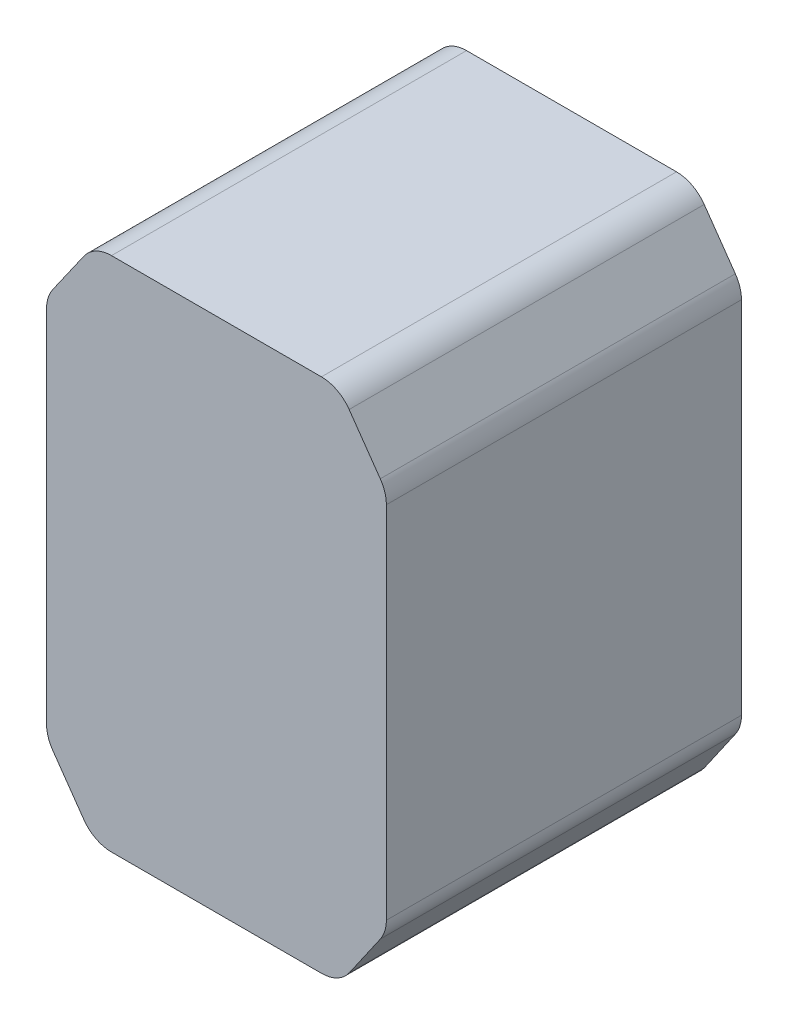
ISO-10303-21;
HEADER;
FILE_DESCRIPTION(('STEP AP214'),'2;1');
FILE_NAME('part.step','',(''),(''),'','','');
FILE_SCHEMA(('AUTOMOTIVE_DESIGN { 1 0 10303 214 1 1 1 1 }'));
ENDSEC;
DATA;
#1=APPLICATION_CONTEXT('core data for automotive mechanical design processes');
#2=APPLICATION_PROTOCOL_DEFINITION('international standard','automotive_design',2000,#1);
#3=PRODUCT_CONTEXT('',#1,'mechanical');
#4=PRODUCT('Part','Part','',(#3));
#5=PRODUCT_RELATED_PRODUCT_CATEGORY('part','',(#4));
#6=PRODUCT_DEFINITION_FORMATION('','',#4);
#7=PRODUCT_DEFINITION_CONTEXT('part definition',#1,'design');
#8=PRODUCT_DEFINITION('design','',#6,#7);
#9=PRODUCT_DEFINITION_SHAPE('','',#8);
#10=(LENGTH_UNIT() NAMED_UNIT(*) SI_UNIT(.MILLI.,.METRE.));
#11=(NAMED_UNIT(*) PLANE_ANGLE_UNIT() SI_UNIT($,.RADIAN.));
#12=(NAMED_UNIT(*) SI_UNIT($,.STERADIAN.) SOLID_ANGLE_UNIT());
#13=UNCERTAINTY_MEASURE_WITH_UNIT(LENGTH_MEASURE(1.E-05),#10,'distance_accuracy_value','');
#14=(GEOMETRIC_REPRESENTATION_CONTEXT(3) GLOBAL_UNCERTAINTY_ASSIGNED_CONTEXT((#13)) GLOBAL_UNIT_ASSIGNED_CONTEXT((#10,
#11,#12)) REPRESENTATION_CONTEXT('',''));
#15=CARTESIAN_POINT('',(0.,0.,0.));
#16=DIRECTION('',(0.,0.,1.));
#17=DIRECTION('',(1.,0.,0.));
#18=AXIS2_PLACEMENT_3D('',#15,#16,#17);
#19=CARTESIAN_POINT('',(20.1,-30.55,21.));
#20=DIRECTION('',(-1.,0.,0.));
#21=DIRECTION('',(0.,0.,1.));
#22=AXIS2_PLACEMENT_3D('',#19,#20,#21);
#23=PLANE('',#22);
#24=DIRECTION('',(0.,0.,1.));
#25=VECTOR('',#24,1.);
#26=CARTESIAN_POINT('',(20.1,-21.2736650373122,-21.));
#27=LINE('',#26,#25);
#28=CARTESIAN_POINT('',(20.1,-21.2736650373122,-21.));
#29=VERTEX_POINT('',#28);
#30=CARTESIAN_POINT('',(20.1,-21.2736650373122,21.));
#31=VERTEX_POINT('',#30);
#32=EDGE_CURVE('E373',#29,#31,#27,.T.);
#33=ORIENTED_EDGE('',*,*,#32,.F.);
#34=DIRECTION('',(0.,1.,0.));
#35=VECTOR('',#34,1.);
#36=CARTESIAN_POINT('',(20.1,-30.55,-21.));
#37=LINE('',#36,#35);
#38=CARTESIAN_POINT('',(20.1,21.2891110767236,-21.));
#39=VERTEX_POINT('',#38);
#40=EDGE_CURVE('E376',#29,#39,#37,.T.);
#41=ORIENTED_EDGE('',*,*,#40,.T.);
#42=DIRECTION('',(0.,0.,1.));
#43=VECTOR('',#42,1.);
#44=CARTESIAN_POINT('',(20.1,21.2891110767236,-21.));
#45=LINE('',#44,#43);
#46=CARTESIAN_POINT('',(20.1,21.2891110767236,21.));
#47=VERTEX_POINT('',#46);
#48=EDGE_CURVE('E327',#39,#47,#45,.T.);
#49=ORIENTED_EDGE('',*,*,#48,.T.);
#50=DIRECTION('',(0.,1.,0.));
#51=VECTOR('',#50,1.);
#52=CARTESIAN_POINT('',(20.1,-30.55,21.));
#53=LINE('',#52,#51);
#54=EDGE_CURVE('E416',#31,#47,#53,.T.);
#55=ORIENTED_EDGE('',*,*,#54,.F.);
#56=EDGE_LOOP('',(#33,#41,#49,#55));
#57=FACE_BOUND('',#56,.T.);
#58=ADVANCED_FACE('F147',(#57),#23,.F.);
#59=CARTESIAN_POINT('',(-20.1,30.55,21.));
#60=DIRECTION('',(0.,-1.,0.));
#61=DIRECTION('',(0.,0.,-1.));
#62=AXIS2_PLACEMENT_3D('',#59,#60,#61);
#63=PLANE('',#62);
#64=DIRECTION('',(-1.,0.,0.));
#65=VECTOR('',#64,1.);
#66=CARTESIAN_POINT('',(-20.1,30.55,-21.));
#67=LINE('',#66,#65);
#68=CARTESIAN_POINT('',(12.4173777537065,30.55,-21.));
#69=VERTEX_POINT('',#68);
#70=CARTESIAN_POINT('',(-12.4173777537065,30.55,-21.));
#71=VERTEX_POINT('',#70);
#72=EDGE_CURVE('E291',#69,#71,#67,.T.);
#73=ORIENTED_EDGE('',*,*,#72,.T.);
#74=DIRECTION('',(0.,0.,1.));
#75=VECTOR('',#74,1.);
#76=CARTESIAN_POINT('',(-12.4173777537065,30.55,-21.));
#77=LINE('',#76,#75);
#78=CARTESIAN_POINT('',(-12.4173777537065,30.55,21.));
#79=VERTEX_POINT('',#78);
#80=EDGE_CURVE('E164',#71,#79,#77,.T.);
#81=ORIENTED_EDGE('',*,*,#80,.T.);
#82=DIRECTION('',(-1.,0.,0.));
#83=VECTOR('',#82,1.);
#84=CARTESIAN_POINT('',(-20.1,30.55,21.));
#85=LINE('',#84,#83);
#86=CARTESIAN_POINT('',(12.4173777537065,30.55,21.));
#87=VERTEX_POINT('',#86);
#88=EDGE_CURVE('E420',#87,#79,#85,.T.);
#89=ORIENTED_EDGE('',*,*,#88,.F.);
#90=DIRECTION('',(0.,0.,1.));
#91=VECTOR('',#90,1.);
#92=CARTESIAN_POINT('',(12.4173777537065,30.55,-21.));
#93=LINE('',#92,#91);
#94=EDGE_CURVE('E275',#69,#87,#93,.T.);
#95=ORIENTED_EDGE('',*,*,#94,.F.);
#96=EDGE_LOOP('',(#73,#81,#89,#95));
#97=FACE_BOUND('',#96,.T.);
#98=ADVANCED_FACE('F481',(#97),#63,.F.);
#99=CARTESIAN_POINT('',(-20.1,-30.55,21.));
#100=DIRECTION('',(1.,0.,0.));
#101=DIRECTION('',(0.,0.,-1.));
#102=AXIS2_PLACEMENT_3D('',#99,#100,#101);
#103=PLANE('',#102);
#104=DIRECTION('',(0.,-1.,0.));
#105=VECTOR('',#104,1.);
#106=CARTESIAN_POINT('',(-20.1,-30.55,-21.));
#107=LINE('',#106,#105);
#108=CARTESIAN_POINT('',(-20.1,21.2891110767236,-21.));
#109=VERTEX_POINT('',#108);
#110=CARTESIAN_POINT('',(-20.1,-21.2891110767236,-21.));
#111=VERTEX_POINT('',#110);
#112=EDGE_CURVE('E431',#109,#111,#107,.T.);
#113=ORIENTED_EDGE('',*,*,#112,.T.);
#114=DIRECTION('',(0.,0.,1.));
#115=VECTOR('',#114,1.);
#116=CARTESIAN_POINT('',(-20.1,-21.2891110767236,-21.));
#117=LINE('',#116,#115);
#118=CARTESIAN_POINT('',(-20.1,-21.2891110767236,21.));
#119=VERTEX_POINT('',#118);
#120=EDGE_CURVE('E172',#111,#119,#117,.T.);
#121=ORIENTED_EDGE('',*,*,#120,.T.);
#122=DIRECTION('',(0.,-1.,0.));
#123=VECTOR('',#122,1.);
#124=CARTESIAN_POINT('',(-20.1,-30.55,21.));
#125=LINE('',#124,#123);
#126=CARTESIAN_POINT('',(-20.1,21.2891110767236,21.));
#127=VERTEX_POINT('',#126);
#128=EDGE_CURVE('E156',#127,#119,#125,.T.);
#129=ORIENTED_EDGE('',*,*,#128,.F.);
#130=DIRECTION('',(0.,0.,1.));
#131=VECTOR('',#130,1.);
#132=CARTESIAN_POINT('',(-20.1,21.2891110767236,-21.));
#133=LINE('',#132,#131);
#134=EDGE_CURVE('E398',#109,#127,#133,.T.);
#135=ORIENTED_EDGE('',*,*,#134,.F.);
#136=EDGE_LOOP('',(#113,#121,#129,#135));
#137=FACE_BOUND('',#136,.T.);
#138=ADVANCED_FACE('F464',(#137),#103,.F.);
#139=CARTESIAN_POINT('',(-20.1,-30.55,21.));
#140=DIRECTION('',(0.,1.,0.));
#141=DIRECTION('',(0.,0.,1.));
#142=AXIS2_PLACEMENT_3D('',#139,#140,#141);
#143=PLANE('',#142);
#144=DIRECTION('',(1.,0.,0.));
#145=VECTOR('',#144,1.);
#146=CARTESIAN_POINT('',(-20.1,-30.55,-21.));
#147=LINE('',#146,#145);
#148=CARTESIAN_POINT('',(-12.4173777537065,-30.55,-21.));
#149=VERTEX_POINT('',#148);
#150=CARTESIAN_POINT('',(12.4395426196354,-30.55,-21.));
#151=VERTEX_POINT('',#150);
#152=EDGE_CURVE('E150',#149,#151,#147,.T.);
#153=ORIENTED_EDGE('',*,*,#152,.T.);
#154=DIRECTION('',(0.,0.,1.));
#155=VECTOR('',#154,1.);
#156=CARTESIAN_POINT('',(12.4395426196354,-30.55,-21.));
#157=LINE('',#156,#155);
#158=CARTESIAN_POINT('',(12.4395426196354,-30.55,21.));
#159=VERTEX_POINT('',#158);
#160=EDGE_CURVE('E383',#151,#159,#157,.T.);
#161=ORIENTED_EDGE('',*,*,#160,.T.);
#162=DIRECTION('',(1.,0.,0.));
#163=VECTOR('',#162,1.);
#164=CARTESIAN_POINT('',(-20.1,-30.55,21.));
#165=LINE('',#164,#163);
#166=CARTESIAN_POINT('',(-12.4173777537065,-30.55,21.));
#167=VERTEX_POINT('',#166);
#168=EDGE_CURVE('E12',#167,#159,#165,.T.);
#169=ORIENTED_EDGE('',*,*,#168,.F.);
#170=DIRECTION('',(0.,0.,1.));
#171=VECTOR('',#170,1.);
#172=CARTESIAN_POINT('',(-12.4173777537065,-30.55,-21.));
#173=LINE('',#172,#171);
#174=EDGE_CURVE('E387',#149,#167,#173,.T.);
#175=ORIENTED_EDGE('',*,*,#174,.F.);
#176=EDGE_LOOP('',(#153,#161,#169,#175));
#177=FACE_BOUND('',#176,.T.);
#178=ADVANCED_FACE('F442',(#177),#143,.F.);
#179=CARTESIAN_POINT('',(0.,0.,21.));
#180=DIRECTION('',(0.,0.,-1.));
#181=DIRECTION('',(-1.,0.,0.));
#182=AXIS2_PLACEMENT_3D('',#179,#180,#181);
#183=PLANE('',#182);
#184=CARTESIAN_POINT('',(16.1,-21.2736650373122,21.));
#185=DIRECTION('',(0.,0.,1.));
#186=DIRECTION('',(1.,0.,0.));
#187=AXIS2_PLACEMENT_3D('',#184,#185,#186);
#188=CIRCLE('',#187,3.99999999999998);
#189=CARTESIAN_POINT('',(19.3865487850616,-23.5537082569487,21.));
#190=VERTEX_POINT('',#189);
#191=EDGE_CURVE('E369',#190,#31,#188,.T.);
#192=ORIENTED_EDGE('',*,*,#191,.T.);
#193=ORIENTED_EDGE('',*,*,#54,.T.);
#194=CARTESIAN_POINT('',(16.1,21.2891110767236,21.));
#195=DIRECTION('',(0.,0.,1.));
#196=DIRECTION('',(1.,0.,0.));
#197=AXIS2_PLACEMENT_3D('',#194,#195,#196);
#198=CIRCLE('',#197,4.00000000000001);
#199=CARTESIAN_POINT('',(19.3769276820762,23.5829604541769,21.));
#200=VERTEX_POINT('',#199);
#201=EDGE_CURVE('E328',#47,#200,#198,.T.);
#202=ORIENTED_EDGE('',*,*,#201,.T.);
#203=DIRECTION('',(-0.573462344363329,0.81923192051904,0.));
#204=VECTOR('',#203,1.);
#205=CARTESIAN_POINT('',(15.6943054357827,28.8438493774533,21.));
#206=LINE('',#205,#204);
#207=CARTESIAN_POINT('',(15.6943054357827,28.8438493774533,21.));
#208=VERTEX_POINT('',#207);
#209=EDGE_CURVE('E332',#200,#208,#206,.T.);
#210=ORIENTED_EDGE('',*,*,#209,.T.);
#211=CARTESIAN_POINT('',(12.4173777537065,26.55,21.));
#212=DIRECTION('',(0.,0.,1.));
#213=DIRECTION('',(1.,0.,0.));
#214=AXIS2_PLACEMENT_3D('',#211,#212,#213);
#215=CIRCLE('',#214,3.99999999999999);
#216=EDGE_CURVE('E270',#208,#87,#215,.T.);
#217=ORIENTED_EDGE('',*,*,#216,.T.);
#218=ORIENTED_EDGE('',*,*,#88,.T.);
#219=CARTESIAN_POINT('',(-12.4173777537065,26.55,21.));
#220=DIRECTION('',(0.,0.,1.));
#221=DIRECTION('',(1.,0.,0.));
#222=AXIS2_PLACEMENT_3D('',#219,#220,#221);
#223=CIRCLE('',#222,4.);
#224=CARTESIAN_POINT('',(-15.6943054357827,28.8438493774533,21.));
#225=VERTEX_POINT('',#224);
#226=EDGE_CURVE('E337',#79,#225,#223,.T.);
#227=ORIENTED_EDGE('',*,*,#226,.T.);
#228=DIRECTION('',(-0.573462344363328,-0.81923192051904,0.));
#229=VECTOR('',#228,1.);
#230=CARTESIAN_POINT('',(-19.3769276820762,23.5829604541769,21.));
#231=LINE('',#230,#229);
#232=CARTESIAN_POINT('',(-19.3769276820762,23.5829604541769,21.));
#233=VERTEX_POINT('',#232);
#234=EDGE_CURVE('E341',#225,#233,#231,.T.);
#235=ORIENTED_EDGE('',*,*,#234,.T.);
#236=CARTESIAN_POINT('',(-16.1,21.2891110767236,21.));
#237=DIRECTION('',(0.,0.,1.));
#238=DIRECTION('',(1.,0.,0.));
#239=AXIS2_PLACEMENT_3D('',#236,#237,#238);
#240=CIRCLE('',#239,4.);
#241=EDGE_CURVE('E345',#233,#127,#240,.T.);
#242=ORIENTED_EDGE('',*,*,#241,.T.);
#243=ORIENTED_EDGE('',*,*,#128,.T.);
#244=CARTESIAN_POINT('',(-16.1,-21.2891110767236,21.));
#245=DIRECTION('',(0.,0.,1.));
#246=DIRECTION('',(1.,0.,0.));
#247=AXIS2_PLACEMENT_3D('',#244,#245,#246);
#248=CIRCLE('',#247,4.);
#249=CARTESIAN_POINT('',(-19.3769276820762,-23.5829604541769,21.));
#250=VERTEX_POINT('',#249);
#251=EDGE_CURVE('E349',#119,#250,#248,.T.);
#252=ORIENTED_EDGE('',*,*,#251,.T.);
#253=DIRECTION('',(0.573462344363328,-0.81923192051904,0.));
#254=VECTOR('',#253,1.);
#255=CARTESIAN_POINT('',(-19.3769276820762,-23.5829604541769,21.));
#256=LINE('',#255,#254);
#257=CARTESIAN_POINT('',(-15.6943054357827,-28.8438493774533,21.));
#258=VERTEX_POINT('',#257);
#259=EDGE_CURVE('E353',#250,#258,#256,.T.);
#260=ORIENTED_EDGE('',*,*,#259,.T.);
#261=CARTESIAN_POINT('',(-12.4173777537065,-26.55,21.));
#262=DIRECTION('',(0.,0.,1.));
#263=DIRECTION('',(1.,0.,0.));
#264=AXIS2_PLACEMENT_3D('',#261,#262,#263);
#265=CIRCLE('',#264,4.);
#266=EDGE_CURVE('E357',#258,#167,#265,.T.);
#267=ORIENTED_EDGE('',*,*,#266,.T.);
#268=ORIENTED_EDGE('',*,*,#168,.T.);
#269=CARTESIAN_POINT('',(12.4395426196354,-26.55,21.));
#270=DIRECTION('',(0.,0.,1.));
#271=DIRECTION('',(1.,0.,0.));
#272=AXIS2_PLACEMENT_3D('',#269,#270,#271);
#273=CIRCLE('',#272,4.);
#274=CARTESIAN_POINT('',(15.7260914046969,-28.8300432196365,21.));
#275=VERTEX_POINT('',#274);
#276=EDGE_CURVE('E361',#159,#275,#273,.T.);
#277=ORIENTED_EDGE('',*,*,#276,.T.);
#278=DIRECTION('',(0.570010804909114,0.821637196265398,0.));
#279=VECTOR('',#278,1.);
#280=CARTESIAN_POINT('',(15.7260914046969,-28.8300432196365,21.));
#281=LINE('',#280,#279);
#282=EDGE_CURVE('E365',#275,#190,#281,.T.);
#283=ORIENTED_EDGE('',*,*,#282,.T.);
#284=EDGE_LOOP('',(#192,#193,#202,#210,#217,#218,#227,#235,#242,#243,#252,#260,#267,#268,#277,#283));
#285=FACE_BOUND('',#284,.T.);
#286=ADVANCED_FACE('F453',(#285),#183,.F.);
#287=CARTESIAN_POINT('',(0.,0.,-21.));
#288=DIRECTION('',(0.,0.,-1.));
#289=DIRECTION('',(-1.,0.,0.));
#290=AXIS2_PLACEMENT_3D('',#287,#288,#289);
#291=PLANE('',#290);
#292=ORIENTED_EDGE('',*,*,#40,.F.);
#293=CARTESIAN_POINT('',(16.1,-21.2736650373122,-21.));
#294=DIRECTION('',(0.,0.,1.));
#295=DIRECTION('',(1.,0.,0.));
#296=AXIS2_PLACEMENT_3D('',#293,#294,#295);
#297=CIRCLE('',#296,3.99999999999998);
#298=CARTESIAN_POINT('',(19.3865487850616,-23.5537082569487,-21.));
#299=VERTEX_POINT('',#298);
#300=EDGE_CURVE('E324',#299,#29,#297,.T.);
#301=ORIENTED_EDGE('',*,*,#300,.F.);
#302=DIRECTION('',(0.570010804909114,0.821637196265398,0.));
#303=VECTOR('',#302,1.);
#304=CARTESIAN_POINT('',(15.7260914046969,-28.8300432196365,-21.));
#305=LINE('',#304,#303);
#306=CARTESIAN_POINT('',(15.7260914046969,-28.8300432196365,-21.));
#307=VERTEX_POINT('',#306);
#308=EDGE_CURVE('E320',#307,#299,#305,.T.);
#309=ORIENTED_EDGE('',*,*,#308,.F.);
#310=CARTESIAN_POINT('',(12.4395426196354,-26.55,-21.));
#311=DIRECTION('',(0.,0.,1.));
#312=DIRECTION('',(1.,0.,0.));
#313=AXIS2_PLACEMENT_3D('',#310,#311,#312);
#314=CIRCLE('',#313,4.);
#315=EDGE_CURVE('E316',#151,#307,#314,.T.);
#316=ORIENTED_EDGE('',*,*,#315,.F.);
#317=ORIENTED_EDGE('',*,*,#152,.F.);
#318=CARTESIAN_POINT('',(-12.4173777537065,-26.55,-21.));
#319=DIRECTION('',(0.,0.,1.));
#320=DIRECTION('',(1.,0.,0.));
#321=AXIS2_PLACEMENT_3D('',#318,#319,#320);
#322=CIRCLE('',#321,4.);
#323=CARTESIAN_POINT('',(-15.6943054357827,-28.8438493774533,-21.));
#324=VERTEX_POINT('',#323);
#325=EDGE_CURVE('E313',#324,#149,#322,.T.);
#326=ORIENTED_EDGE('',*,*,#325,.F.);
#327=DIRECTION('',(0.573462344363328,-0.81923192051904,0.));
#328=VECTOR('',#327,1.);
#329=CARTESIAN_POINT('',(-19.3769276820762,-23.5829604541769,-21.));
#330=LINE('',#329,#328);
#331=CARTESIAN_POINT('',(-19.3769276820762,-23.5829604541769,-21.));
#332=VERTEX_POINT('',#331);
#333=EDGE_CURVE('E309',#332,#324,#330,.T.);
#334=ORIENTED_EDGE('',*,*,#333,.F.);
#335=CARTESIAN_POINT('',(-16.1,-21.2891110767236,-21.));
#336=DIRECTION('',(0.,0.,1.));
#337=DIRECTION('',(1.,0.,0.));
#338=AXIS2_PLACEMENT_3D('',#335,#336,#337);
#339=CIRCLE('',#338,4.);
#340=EDGE_CURVE('E306',#111,#332,#339,.T.);
#341=ORIENTED_EDGE('',*,*,#340,.F.);
#342=ORIENTED_EDGE('',*,*,#112,.F.);
#343=CARTESIAN_POINT('',(-16.1,21.2891110767236,-21.));
#344=DIRECTION('',(0.,0.,1.));
#345=DIRECTION('',(1.,0.,0.));
#346=AXIS2_PLACEMENT_3D('',#343,#344,#345);
#347=CIRCLE('',#346,4.);
#348=CARTESIAN_POINT('',(-19.3769276820762,23.5829604541769,-21.));
#349=VERTEX_POINT('',#348);
#350=EDGE_CURVE('E303',#349,#109,#347,.T.);
#351=ORIENTED_EDGE('',*,*,#350,.F.);
#352=DIRECTION('',(-0.573462344363328,-0.81923192051904,0.));
#353=VECTOR('',#352,1.);
#354=CARTESIAN_POINT('',(-19.3769276820762,23.5829604541769,-21.));
#355=LINE('',#354,#353);
#356=CARTESIAN_POINT('',(-15.6943054357827,28.8438493774533,-21.));
#357=VERTEX_POINT('',#356);
#358=EDGE_CURVE('E296',#357,#349,#355,.T.);
#359=ORIENTED_EDGE('',*,*,#358,.F.);
#360=CARTESIAN_POINT('',(-12.4173777537065,26.55,-21.));
#361=DIRECTION('',(0.,0.,1.));
#362=DIRECTION('',(1.,0.,0.));
#363=AXIS2_PLACEMENT_3D('',#360,#361,#362);
#364=CIRCLE('',#363,4.);
#365=EDGE_CURVE('E293',#71,#357,#364,.T.);
#366=ORIENTED_EDGE('',*,*,#365,.F.);
#367=ORIENTED_EDGE('',*,*,#72,.F.);
#368=CARTESIAN_POINT('',(12.4173777537065,26.55,-21.));
#369=DIRECTION('',(0.,0.,1.));
#370=DIRECTION('',(1.,0.,0.));
#371=AXIS2_PLACEMENT_3D('',#368,#369,#370);
#372=CIRCLE('',#371,3.99999999999999);
#373=CARTESIAN_POINT('',(15.6943054357827,28.8438493774533,-21.));
#374=VERTEX_POINT('',#373);
#375=EDGE_CURVE('E267',#374,#69,#372,.T.);
#376=ORIENTED_EDGE('',*,*,#375,.F.);
#377=DIRECTION('',(-0.573462344363329,0.81923192051904,0.));
#378=VECTOR('',#377,1.);
#379=CARTESIAN_POINT('',(15.6943054357827,28.8438493774533,-21.));
#380=LINE('',#379,#378);
#381=CARTESIAN_POINT('',(19.3769276820762,23.5829604541769,-21.));
#382=VERTEX_POINT('',#381);
#383=EDGE_CURVE('E279',#382,#374,#380,.T.);
#384=ORIENTED_EDGE('',*,*,#383,.F.);
#385=CARTESIAN_POINT('',(16.1,21.2891110767236,-21.));
#386=DIRECTION('',(0.,0.,1.));
#387=DIRECTION('',(1.,0.,0.));
#388=AXIS2_PLACEMENT_3D('',#385,#386,#387);
#389=CIRCLE('',#388,4.00000000000001);
#390=EDGE_CURVE('E285',#39,#382,#389,.T.);
#391=ORIENTED_EDGE('',*,*,#390,.F.);
#392=EDGE_LOOP('',(#292,#301,#309,#316,#317,#326,#334,#341,#342,#351,#359,#366,#367,#376,#384,#391));
#393=FACE_BOUND('',#392,.T.);
#394=ADVANCED_FACE('F289',(#393),#291,.T.);
#395=CARTESIAN_POINT('',(16.1,21.2891110767236,-21.));
#396=DIRECTION('',(0.,0.,1.));
#397=DIRECTION('',(1.,0.,0.));
#398=AXIS2_PLACEMENT_3D('',#395,#396,#397);
#399=CYLINDRICAL_SURFACE('',#398,4.00000000000001);
#400=ORIENTED_EDGE('',*,*,#201,.F.);
#401=ORIENTED_EDGE('',*,*,#48,.F.);
#402=ORIENTED_EDGE('',*,*,#390,.T.);
#403=DIRECTION('',(0.,0.,1.));
#404=VECTOR('',#403,1.);
#405=CARTESIAN_POINT('',(19.3769276820762,23.5829604541769,-21.));
#406=LINE('',#405,#404);
#407=EDGE_CURVE('E276',#382,#200,#406,.T.);
#408=ORIENTED_EDGE('',*,*,#407,.T.);
#409=EDGE_LOOP('',(#400,#401,#402,#408));
#410=FACE_BOUND('',#409,.T.);
#411=ADVANCED_FACE('F493',(#410),#399,.T.);
#412=CARTESIAN_POINT('',(15.6943054357827,28.8438493774533,-21.));
#413=DIRECTION('',(0.81923192051904,0.573462344363329,0.));
#414=DIRECTION('',(-0.573462344363329,0.81923192051904,0.));
#415=AXIS2_PLACEMENT_3D('',#412,#413,#414);
#416=PLANE('',#415);
#417=ORIENTED_EDGE('',*,*,#209,.F.);
#418=ORIENTED_EDGE('',*,*,#407,.F.);
#419=ORIENTED_EDGE('',*,*,#383,.T.);
#420=DIRECTION('',(0.,0.,1.));
#421=VECTOR('',#420,1.);
#422=CARTESIAN_POINT('',(15.6943054357827,28.8438493774533,-21.));
#423=LINE('',#422,#421);
#424=EDGE_CURVE('E263',#374,#208,#423,.T.);
#425=ORIENTED_EDGE('',*,*,#424,.T.);
#426=EDGE_LOOP('',(#417,#418,#419,#425));
#427=FACE_BOUND('',#426,.T.);
#428=ADVANCED_FACE('F280',(#427),#416,.T.);
#429=CARTESIAN_POINT('',(12.4173777537065,26.55,-21.));
#430=DIRECTION('',(0.,0.,1.));
#431=DIRECTION('',(1.,0.,0.));
#432=AXIS2_PLACEMENT_3D('',#429,#430,#431);
#433=CYLINDRICAL_SURFACE('',#432,3.99999999999999);
#434=ORIENTED_EDGE('',*,*,#216,.F.);
#435=ORIENTED_EDGE('',*,*,#424,.F.);
#436=ORIENTED_EDGE('',*,*,#375,.T.);
#437=ORIENTED_EDGE('',*,*,#94,.T.);
#438=EDGE_LOOP('',(#434,#435,#436,#437));
#439=FACE_BOUND('',#438,.T.);
#440=ADVANCED_FACE('F265',(#439),#433,.T.);
#441=CARTESIAN_POINT('',(-12.4173777537065,26.55,-21.));
#442=DIRECTION('',(0.,0.,1.));
#443=DIRECTION('',(1.,0.,0.));
#444=AXIS2_PLACEMENT_3D('',#441,#442,#443);
#445=CYLINDRICAL_SURFACE('',#444,4.);
#446=ORIENTED_EDGE('',*,*,#226,.F.);
#447=ORIENTED_EDGE('',*,*,#80,.F.);
#448=ORIENTED_EDGE('',*,*,#365,.T.);
#449=DIRECTION('',(0.,0.,1.));
#450=VECTOR('',#449,1.);
#451=CARTESIAN_POINT('',(-15.6943054357827,28.8438493774533,-21.));
#452=LINE('',#451,#450);
#453=EDGE_CURVE('E404',#357,#225,#452,.T.);
#454=ORIENTED_EDGE('',*,*,#453,.T.);
#455=EDGE_LOOP('',(#446,#447,#448,#454));
#456=FACE_BOUND('',#455,.T.);
#457=ADVANCED_FACE('F471',(#456),#445,.T.);
#458=CARTESIAN_POINT('',(-19.3769276820762,23.5829604541769,-21.));
#459=DIRECTION('',(-0.81923192051904,0.573462344363328,0.));
#460=DIRECTION('',(-0.573462344363328,-0.81923192051904,0.));
#461=AXIS2_PLACEMENT_3D('',#458,#459,#460);
#462=PLANE('',#461);
#463=ORIENTED_EDGE('',*,*,#234,.F.);
#464=ORIENTED_EDGE('',*,*,#453,.F.);
#465=ORIENTED_EDGE('',*,*,#358,.T.);
#466=DIRECTION('',(0.,0.,1.));
#467=VECTOR('',#466,1.);
#468=CARTESIAN_POINT('',(-19.3769276820762,23.5829604541769,-21.));
#469=LINE('',#468,#467);
#470=EDGE_CURVE('E401',#349,#233,#469,.T.);
#471=ORIENTED_EDGE('',*,*,#470,.T.);
#472=EDGE_LOOP('',(#463,#464,#465,#471));
#473=FACE_BOUND('',#472,.T.);
#474=ADVANCED_FACE('F470',(#473),#462,.T.);
#475=CARTESIAN_POINT('',(-16.1,21.2891110767236,-21.));
#476=DIRECTION('',(0.,0.,1.));
#477=DIRECTION('',(1.,0.,0.));
#478=AXIS2_PLACEMENT_3D('',#475,#476,#477);
#479=CYLINDRICAL_SURFACE('',#478,4.);
#480=ORIENTED_EDGE('',*,*,#241,.F.);
#481=ORIENTED_EDGE('',*,*,#470,.F.);
#482=ORIENTED_EDGE('',*,*,#350,.T.);
#483=ORIENTED_EDGE('',*,*,#134,.T.);
#484=EDGE_LOOP('',(#480,#481,#482,#483));
#485=FACE_BOUND('',#484,.T.);
#486=ADVANCED_FACE('F466',(#485),#479,.T.);
#487=CARTESIAN_POINT('',(-16.1,-21.2891110767236,-21.));
#488=DIRECTION('',(0.,0.,1.));
#489=DIRECTION('',(1.,0.,0.));
#490=AXIS2_PLACEMENT_3D('',#487,#488,#489);
#491=CYLINDRICAL_SURFACE('',#490,4.);
#492=ORIENTED_EDGE('',*,*,#251,.F.);
#493=ORIENTED_EDGE('',*,*,#120,.F.);
#494=ORIENTED_EDGE('',*,*,#340,.T.);
#495=DIRECTION('',(0.,0.,1.));
#496=VECTOR('',#495,1.);
#497=CARTESIAN_POINT('',(-19.3769276820762,-23.5829604541769,-21.));
#498=LINE('',#497,#496);
#499=EDGE_CURVE('E393',#332,#250,#498,.T.);
#500=ORIENTED_EDGE('',*,*,#499,.T.);
#501=EDGE_LOOP('',(#492,#493,#494,#500));
#502=FACE_BOUND('',#501,.T.);
#503=ADVANCED_FACE('F461',(#502),#491,.T.);
#504=CARTESIAN_POINT('',(-19.3769276820762,-23.5829604541769,-21.));
#505=DIRECTION('',(-0.81923192051904,-0.573462344363328,0.));
#506=DIRECTION('',(0.573462344363328,-0.819231920519041,0.));
#507=AXIS2_PLACEMENT_3D('',#504,#505,#506);
#508=PLANE('',#507);
#509=ORIENTED_EDGE('',*,*,#259,.F.);
#510=ORIENTED_EDGE('',*,*,#499,.F.);
#511=ORIENTED_EDGE('',*,*,#333,.T.);
#512=DIRECTION('',(0.,0.,1.));
#513=VECTOR('',#512,1.);
#514=CARTESIAN_POINT('',(-15.6943054357827,-28.8438493774533,-21.));
#515=LINE('',#514,#513);
#516=EDGE_CURVE('E390',#324,#258,#515,.T.);
#517=ORIENTED_EDGE('',*,*,#516,.T.);
#518=EDGE_LOOP('',(#509,#510,#511,#517));
#519=FACE_BOUND('',#518,.T.);
#520=ADVANCED_FACE('F459',(#519),#508,.T.);
#521=CARTESIAN_POINT('',(-12.4173777537065,-26.55,-21.));
#522=DIRECTION('',(0.,0.,1.));
#523=DIRECTION('',(1.,0.,0.));
#524=AXIS2_PLACEMENT_3D('',#521,#522,#523);
#525=CYLINDRICAL_SURFACE('',#524,4.);
#526=ORIENTED_EDGE('',*,*,#266,.F.);
#527=ORIENTED_EDGE('',*,*,#516,.F.);
#528=ORIENTED_EDGE('',*,*,#325,.T.);
#529=ORIENTED_EDGE('',*,*,#174,.T.);
#530=EDGE_LOOP('',(#526,#527,#528,#529));
#531=FACE_BOUND('',#530,.T.);
#532=ADVANCED_FACE('F457',(#531),#525,.T.);
#533=CARTESIAN_POINT('',(16.1,-21.2736650373122,-21.));
#534=DIRECTION('',(0.,0.,1.));
#535=DIRECTION('',(1.,0.,0.));
#536=AXIS2_PLACEMENT_3D('',#533,#534,#535);
#537=CYLINDRICAL_SURFACE('',#536,3.99999999999998);
#538=ORIENTED_EDGE('',*,*,#191,.F.);
#539=DIRECTION('',(0.,0.,1.));
#540=VECTOR('',#539,1.);
#541=CARTESIAN_POINT('',(19.3865487850616,-23.5537082569487,-21.));
#542=LINE('',#541,#540);
#543=EDGE_CURVE('E377',#299,#190,#542,.T.);
#544=ORIENTED_EDGE('',*,*,#543,.F.);
#545=ORIENTED_EDGE('',*,*,#300,.T.);
#546=ORIENTED_EDGE('',*,*,#32,.T.);
#547=EDGE_LOOP('',(#538,#544,#545,#546));
#548=FACE_BOUND('',#547,.T.);
#549=ADVANCED_FACE('F494',(#548),#537,.T.);
#550=CARTESIAN_POINT('',(15.7260914046969,-28.8300432196365,-21.));
#551=DIRECTION('',(0.821637196265398,-0.570010804909114,0.));
#552=DIRECTION('',(0.570010804909114,0.821637196265398,0.));
#553=AXIS2_PLACEMENT_3D('',#550,#551,#552);
#554=PLANE('',#553);
#555=ORIENTED_EDGE('',*,*,#282,.F.);
#556=DIRECTION('',(0.,0.,1.));
#557=VECTOR('',#556,1.);
#558=CARTESIAN_POINT('',(15.7260914046969,-28.8300432196365,-21.));
#559=LINE('',#558,#557);
#560=EDGE_CURVE('E380',#307,#275,#559,.T.);
#561=ORIENTED_EDGE('',*,*,#560,.F.);
#562=ORIENTED_EDGE('',*,*,#308,.T.);
#563=ORIENTED_EDGE('',*,*,#543,.T.);
#564=EDGE_LOOP('',(#555,#561,#562,#563));
#565=FACE_BOUND('',#564,.T.);
#566=ADVANCED_FACE('F496',(#565),#554,.T.);
#567=CARTESIAN_POINT('',(12.4395426196354,-26.55,-21.));
#568=DIRECTION('',(0.,0.,1.));
#569=DIRECTION('',(1.,0.,0.));
#570=AXIS2_PLACEMENT_3D('',#567,#568,#569);
#571=CYLINDRICAL_SURFACE('',#570,4.);
#572=ORIENTED_EDGE('',*,*,#276,.F.);
#573=ORIENTED_EDGE('',*,*,#160,.F.);
#574=ORIENTED_EDGE('',*,*,#315,.T.);
#575=ORIENTED_EDGE('',*,*,#560,.T.);
#576=EDGE_LOOP('',(#572,#573,#574,#575));
#577=FACE_BOUND('',#576,.T.);
#578=ADVANCED_FACE('F450',(#577),#571,.T.);
#579=CLOSED_SHELL('',(#58,#98,#138,#178,#286,#394,#411,#428,#440,#457,#474,#486,#503,#520,#532,
#549,#566,#578));
#580=MANIFOLD_SOLID_BREP('B2',#579);
#581=ADVANCED_BREP_SHAPE_REPRESENTATION('',(#18,#580),#14);
#582=SHAPE_DEFINITION_REPRESENTATION(#9,#581);
ENDSEC;
END-ISO-10303-21;
